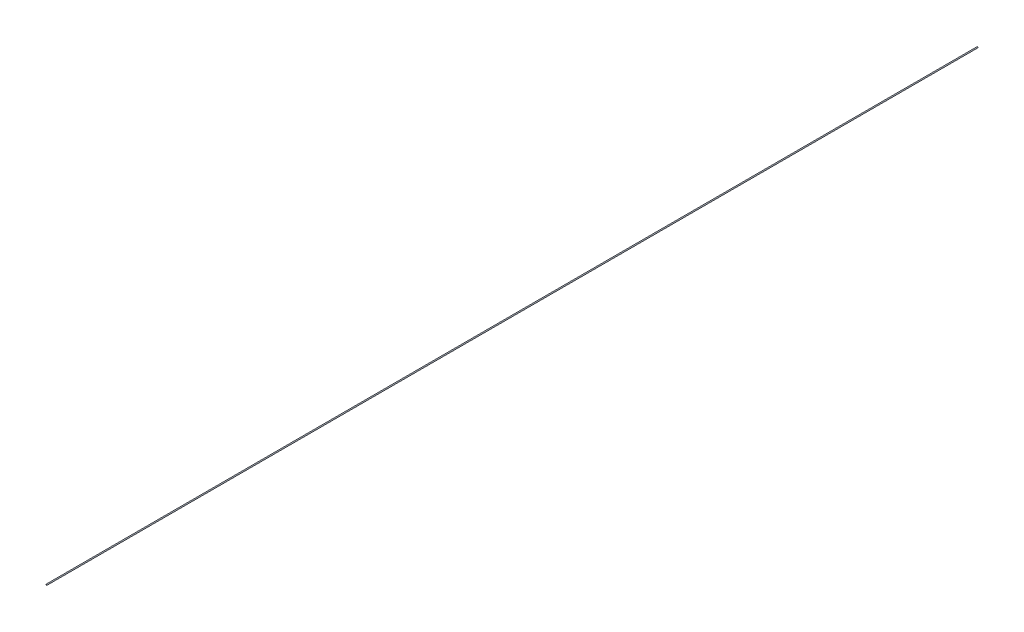
ISO-10303-21;
HEADER;
FILE_DESCRIPTION(('STEP AP214'),'2;1');
FILE_NAME('part.step','',(''),(''),'','','');
FILE_SCHEMA(('AUTOMOTIVE_DESIGN { 1 0 10303 214 1 1 1 1 }'));
ENDSEC;
DATA;
#1=APPLICATION_CONTEXT('core data for automotive mechanical design processes');
#2=APPLICATION_PROTOCOL_DEFINITION('international standard','automotive_design',2000,#1);
#3=PRODUCT_CONTEXT('',#1,'mechanical');
#4=PRODUCT('Part','Part','',(#3));
#5=PRODUCT_RELATED_PRODUCT_CATEGORY('part','',(#4));
#6=PRODUCT_DEFINITION_FORMATION('','',#4);
#7=PRODUCT_DEFINITION_CONTEXT('part definition',#1,'design');
#8=PRODUCT_DEFINITION('design','',#6,#7);
#9=PRODUCT_DEFINITION_SHAPE('','',#8);
#10=(LENGTH_UNIT() NAMED_UNIT(*) SI_UNIT(.MILLI.,.METRE.));
#11=(NAMED_UNIT(*) PLANE_ANGLE_UNIT() SI_UNIT($,.RADIAN.));
#12=(NAMED_UNIT(*) SI_UNIT($,.STERADIAN.) SOLID_ANGLE_UNIT());
#13=UNCERTAINTY_MEASURE_WITH_UNIT(LENGTH_MEASURE(1.E-05),#10,'distance_accuracy_value','');
#14=(GEOMETRIC_REPRESENTATION_CONTEXT(3) GLOBAL_UNCERTAINTY_ASSIGNED_CONTEXT((#13)) GLOBAL_UNIT_ASSIGNED_CONTEXT((#10,
#11,#12)) REPRESENTATION_CONTEXT('',''));
#15=CARTESIAN_POINT('',(0.,0.,0.));
#16=DIRECTION('',(0.,0.,1.));
#17=DIRECTION('',(1.,0.,0.));
#18=AXIS2_PLACEMENT_3D('',#15,#16,#17);
#19=CARTESIAN_POINT('',(0.,0.,1092.962));
#20=DIRECTION('',(0.,0.,-1.));
#21=DIRECTION('',(-1.,0.,0.));
#22=AXIS2_PLACEMENT_3D('',#19,#20,#21);
#23=CYLINDRICAL_SURFACE('',#22,0.6);
#24=CARTESIAN_POINT('',(0.,0.,1092.962));
#25=DIRECTION('',(0.,0.,1.));
#26=DIRECTION('',(1.,0.,0.));
#27=AXIS2_PLACEMENT_3D('',#24,#25,#26);
#28=CIRCLE('',#27,0.6);
#29=CARTESIAN_POINT('',(0.6,0.,1092.962));
#30=VERTEX_POINT('',#29);
#31=EDGE_CURVE('E10',#30,#30,#28,.T.);
#32=ORIENTED_EDGE('',*,*,#31,.F.);
#33=EDGE_LOOP('',(#32));
#34=FACE_BOUND('',#33,.T.);
#35=CARTESIAN_POINT('',(0.,0.,0.));
#36=DIRECTION('',(0.,0.,1.));
#37=DIRECTION('',(1.,0.,0.));
#38=AXIS2_PLACEMENT_3D('',#35,#36,#37);
#39=CIRCLE('',#38,0.6);
#40=CARTESIAN_POINT('',(0.6,0.,0.));
#41=VERTEX_POINT('',#40);
#42=EDGE_CURVE('E34',#41,#41,#39,.T.);
#43=ORIENTED_EDGE('',*,*,#42,.T.);
#44=EDGE_LOOP('',(#43));
#45=FACE_BOUND('',#44,.T.);
#46=ADVANCED_FACE('F31',(#34,#45),#23,.T.);
#47=CARTESIAN_POINT('',(0.,0.,1092.962));
#48=DIRECTION('',(0.,0.,1.));
#49=DIRECTION('',(1.,0.,0.));
#50=AXIS2_PLACEMENT_3D('',#47,#48,#49);
#51=PLANE('',#50);
#52=ORIENTED_EDGE('',*,*,#31,.T.);
#53=EDGE_LOOP('',(#52));
#54=FACE_BOUND('',#53,.T.);
#55=ADVANCED_FACE('F46',(#54),#51,.T.);
#56=CARTESIAN_POINT('',(0.,0.,0.));
#57=DIRECTION('',(0.,0.,1.));
#58=DIRECTION('',(1.,0.,0.));
#59=AXIS2_PLACEMENT_3D('',#56,#57,#58);
#60=PLANE('',#59);
#61=ORIENTED_EDGE('',*,*,#42,.F.);
#62=EDGE_LOOP('',(#61));
#63=FACE_BOUND('',#62,.T.);
#64=ADVANCED_FACE('F44',(#63),#60,.F.);
#65=CLOSED_SHELL('',(#46,#55,#64));
#66=MANIFOLD_SOLID_BREP('B2',#65);
#67=ADVANCED_BREP_SHAPE_REPRESENTATION('',(#18,#66),#14);
#68=SHAPE_DEFINITION_REPRESENTATION(#9,#67);
ENDSEC;
END-ISO-10303-21;
